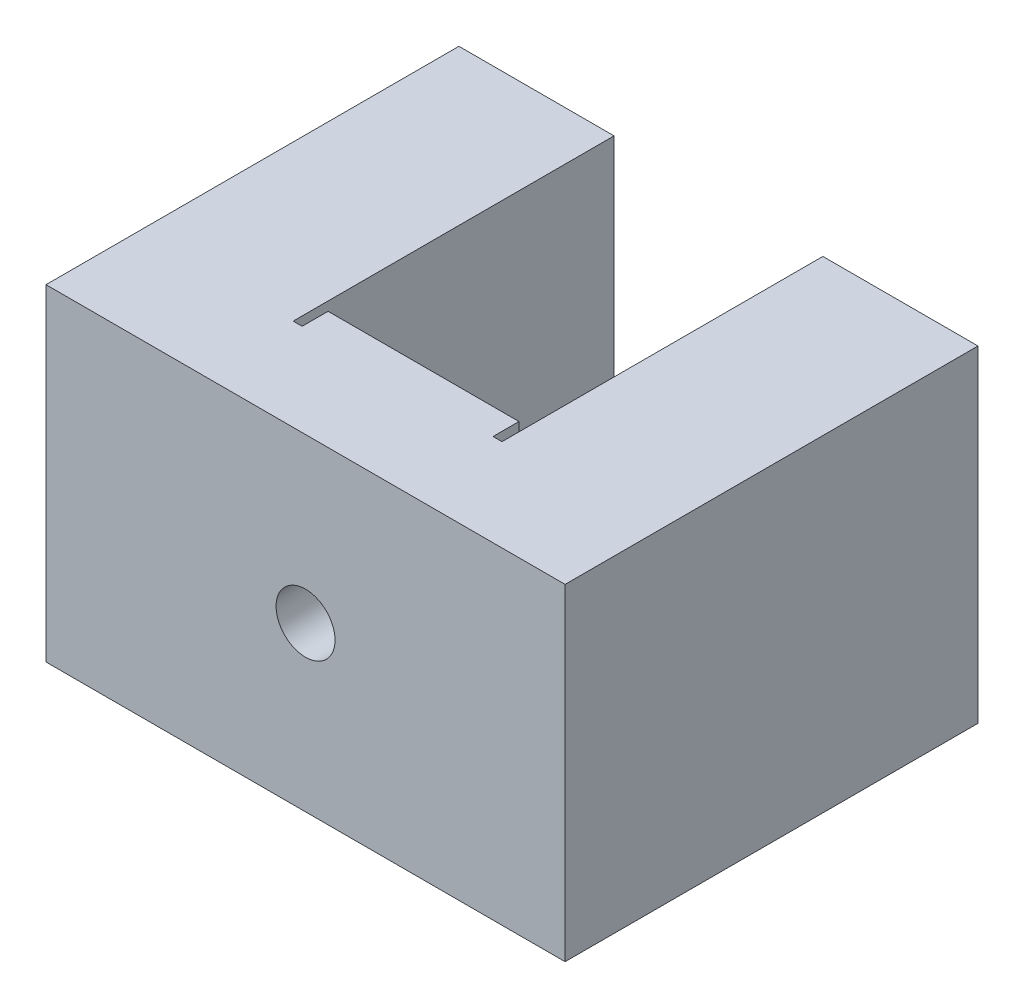
ISO-10303-21;
HEADER;
FILE_DESCRIPTION(('STEP AP214'),'2;1');
FILE_NAME('part.step','',(''),(''),'','','');
FILE_SCHEMA(('AUTOMOTIVE_DESIGN { 1 0 10303 214 1 1 1 1 }'));
ENDSEC;
DATA;
#1=APPLICATION_CONTEXT('core data for automotive mechanical design processes');
#2=APPLICATION_PROTOCOL_DEFINITION('international standard','automotive_design',2000,#1);
#3=PRODUCT_CONTEXT('',#1,'mechanical');
#4=PRODUCT('Part','Part','',(#3));
#5=PRODUCT_RELATED_PRODUCT_CATEGORY('part','',(#4));
#6=PRODUCT_DEFINITION_FORMATION('','',#4);
#7=PRODUCT_DEFINITION_CONTEXT('part definition',#1,'design');
#8=PRODUCT_DEFINITION('design','',#6,#7);
#9=PRODUCT_DEFINITION_SHAPE('','',#8);
#10=(LENGTH_UNIT() NAMED_UNIT(*) SI_UNIT(.MILLI.,.METRE.));
#11=(NAMED_UNIT(*) PLANE_ANGLE_UNIT() SI_UNIT($,.RADIAN.));
#12=(NAMED_UNIT(*) SI_UNIT($,.STERADIAN.) SOLID_ANGLE_UNIT());
#13=UNCERTAINTY_MEASURE_WITH_UNIT(LENGTH_MEASURE(1.E-05),#10,'distance_accuracy_value','');
#14=(GEOMETRIC_REPRESENTATION_CONTEXT(3) GLOBAL_UNCERTAINTY_ASSIGNED_CONTEXT((#13)) GLOBAL_UNIT_ASSIGNED_CONTEXT((#10,
#11,#12)) REPRESENTATION_CONTEXT('',''));
#15=CARTESIAN_POINT('',(0.,0.,0.));
#16=DIRECTION('',(0.,0.,1.));
#17=DIRECTION('',(1.,0.,0.));
#18=AXIS2_PLACEMENT_3D('',#15,#16,#17);
#19=CARTESIAN_POINT('',(0.,0.,0.));
#20=DIRECTION('',(0.,0.,-1.));
#21=DIRECTION('',(-1.,0.,0.));
#22=AXIS2_PLACEMENT_3D('',#19,#20,#21);
#23=PLANE('',#22);
#24=DIRECTION('',(0.,1.,0.));
#25=VECTOR('',#24,1.);
#26=CARTESIAN_POINT('',(8.09,0.,0.));
#27=LINE('',#26,#25);
#28=CARTESIAN_POINT('',(8.09,-13.85,0.));
#29=VERTEX_POINT('',#28);
#30=CARTESIAN_POINT('',(8.09,13.85,0.));
#31=VERTEX_POINT('',#30);
#32=EDGE_CURVE('E151',#29,#31,#27,.T.);
#33=ORIENTED_EDGE('',*,*,#32,.F.);
#34=DIRECTION('',(1.,0.,0.));
#35=VECTOR('',#34,1.);
#36=CARTESIAN_POINT('',(22.,-13.85,0.));
#37=LINE('',#36,#35);
#38=CARTESIAN_POINT('',(-8.09,-13.85,0.));
#39=VERTEX_POINT('',#38);
#40=EDGE_CURVE('E157',#39,#29,#37,.T.);
#41=ORIENTED_EDGE('',*,*,#40,.F.);
#42=DIRECTION('',(0.,1.,0.));
#43=VECTOR('',#42,1.);
#44=CARTESIAN_POINT('',(-8.09,0.,0.));
#45=LINE('',#44,#43);
#46=CARTESIAN_POINT('',(-8.09,13.85,0.));
#47=VERTEX_POINT('',#46);
#48=EDGE_CURVE('E171',#39,#47,#45,.T.);
#49=ORIENTED_EDGE('',*,*,#48,.T.);
#50=DIRECTION('',(-1.,0.,0.));
#51=VECTOR('',#50,1.);
#52=CARTESIAN_POINT('',(22.,13.85,0.));
#53=LINE('',#52,#51);
#54=EDGE_CURVE('E245',#31,#47,#53,.T.);
#55=ORIENTED_EDGE('',*,*,#54,.F.);
#56=EDGE_LOOP('',(#33,#41,#49,#55));
#57=FACE_BOUND('',#56,.T.);
#58=CARTESIAN_POINT('',(0.,0.,0.));
#59=DIRECTION('',(0.,0.,1.));
#60=DIRECTION('',(1.,0.,0.));
#61=AXIS2_PLACEMENT_3D('',#58,#59,#60);
#62=CIRCLE('',#61,2.5);
#63=CARTESIAN_POINT('',(2.5,0.,0.));
#64=VERTEX_POINT('',#63);
#65=EDGE_CURVE('E192',#64,#64,#62,.T.);
#66=ORIENTED_EDGE('',*,*,#65,.T.);
#67=EDGE_LOOP('',(#66));
#68=FACE_BOUND('',#67,.T.);
#69=ADVANCED_FACE('F40',(#57,#68),#23,.T.);
#70=CARTESIAN_POINT('',(22.,-13.85,10.));
#71=DIRECTION('',(0.,1.,0.));
#72=DIRECTION('',(0.,0.,1.));
#73=AXIS2_PLACEMENT_3D('',#70,#71,#72);
#74=PLANE('',#73);
#75=DIRECTION('',(-1.,0.,0.));
#76=VECTOR('',#75,1.);
#77=CARTESIAN_POINT('',(0.,-13.85,2.2));
#78=LINE('',#77,#76);
#79=CARTESIAN_POINT('',(8.85,-13.85,2.2));
#80=VERTEX_POINT('',#79);
#81=CARTESIAN_POINT('',(8.09,-13.85,2.2));
#82=VERTEX_POINT('',#81);
#83=EDGE_CURVE('E141',#80,#82,#78,.T.);
#84=ORIENTED_EDGE('',*,*,#83,.F.);
#85=DIRECTION('',(0.,0.,1.));
#86=VECTOR('',#85,1.);
#87=CARTESIAN_POINT('',(8.85,-13.85,-25.));
#88=LINE('',#87,#86);
#89=CARTESIAN_POINT('',(8.85,-13.85,-25.));
#90=VERTEX_POINT('',#89);
#91=EDGE_CURVE('E235',#90,#80,#88,.T.);
#92=ORIENTED_EDGE('',*,*,#91,.F.);
#93=DIRECTION('',(-1.,0.,0.));
#94=VECTOR('',#93,1.);
#95=CARTESIAN_POINT('',(0.,-13.85,-25.));
#96=LINE('',#95,#94);
#97=CARTESIAN_POINT('',(22.,-13.85,-25.));
#98=VERTEX_POINT('',#97);
#99=EDGE_CURVE('E232',#98,#90,#96,.T.);
#100=ORIENTED_EDGE('',*,*,#99,.F.);
#101=DIRECTION('',(0.,0.,-1.));
#102=VECTOR('',#101,1.);
#103=CARTESIAN_POINT('',(22.,-13.85,10.));
#104=LINE('',#103,#102);
#105=CARTESIAN_POINT('',(22.,-13.85,10.));
#106=VERTEX_POINT('',#105);
#107=EDGE_CURVE('E49',#106,#98,#104,.T.);
#108=ORIENTED_EDGE('',*,*,#107,.F.);
#109=DIRECTION('',(1.,0.,0.));
#110=VECTOR('',#109,1.);
#111=CARTESIAN_POINT('',(22.,-13.85,10.));
#112=LINE('',#111,#110);
#113=CARTESIAN_POINT('',(-22.,-13.85,10.));
#114=VERTEX_POINT('',#113);
#115=EDGE_CURVE('E244',#114,#106,#112,.T.);
#116=ORIENTED_EDGE('',*,*,#115,.F.);
#117=DIRECTION('',(0.,0.,-1.));
#118=VECTOR('',#117,1.);
#119=CARTESIAN_POINT('',(-22.,-13.85,10.));
#120=LINE('',#119,#118);
#121=CARTESIAN_POINT('',(-22.,-13.85,-25.));
#122=VERTEX_POINT('',#121);
#123=EDGE_CURVE('E11',#114,#122,#120,.T.);
#124=ORIENTED_EDGE('',*,*,#123,.T.);
#125=DIRECTION('',(-1.,0.,0.));
#126=VECTOR('',#125,1.);
#127=CARTESIAN_POINT('',(0.,-13.85,-25.));
#128=LINE('',#127,#126);
#129=CARTESIAN_POINT('',(-8.85,-13.85,-25.));
#130=VERTEX_POINT('',#129);
#131=EDGE_CURVE('E206',#130,#122,#128,.T.);
#132=ORIENTED_EDGE('',*,*,#131,.F.);
#133=DIRECTION('',(0.,0.,1.));
#134=VECTOR('',#133,1.);
#135=CARTESIAN_POINT('',(-8.85,-13.85,-25.));
#136=LINE('',#135,#134);
#137=CARTESIAN_POINT('',(-8.85,-13.85,2.2));
#138=VERTEX_POINT('',#137);
#139=EDGE_CURVE('E214',#130,#138,#136,.T.);
#140=ORIENTED_EDGE('',*,*,#139,.T.);
#141=DIRECTION('',(-1.,0.,0.));
#142=VECTOR('',#141,1.);
#143=CARTESIAN_POINT('',(0.,-13.85,2.2));
#144=LINE('',#143,#142);
#145=CARTESIAN_POINT('',(-8.09,-13.85,2.2));
#146=VERTEX_POINT('',#145);
#147=EDGE_CURVE('E170',#146,#138,#144,.T.);
#148=ORIENTED_EDGE('',*,*,#147,.F.);
#149=DIRECTION('',(0.,0.,-1.));
#150=VECTOR('',#149,1.);
#151=CARTESIAN_POINT('',(-8.09,-13.85,2.2));
#152=LINE('',#151,#150);
#153=EDGE_CURVE('E183',#146,#39,#152,.T.);
#154=ORIENTED_EDGE('',*,*,#153,.T.);
#155=ORIENTED_EDGE('',*,*,#40,.T.);
#156=DIRECTION('',(0.,0.,-1.));
#157=VECTOR('',#156,1.);
#158=CARTESIAN_POINT('',(8.09,-13.85,2.2));
#159=LINE('',#158,#157);
#160=EDGE_CURVE('E132',#82,#29,#159,.T.);
#161=ORIENTED_EDGE('',*,*,#160,.F.);
#162=EDGE_LOOP('',(#84,#92,#100,#108,#116,#124,#132,#140,#148,#154,#155,#161));
#163=FACE_BOUND('',#162,.T.);
#164=ADVANCED_FACE('F154',(#163),#74,.F.);
#165=CARTESIAN_POINT('',(22.,13.85,10.));
#166=DIRECTION('',(0.,-1.,0.));
#167=DIRECTION('',(1.,0.,0.));
#168=AXIS2_PLACEMENT_3D('',#165,#166,#167);
#169=PLANE('',#168);
#170=DIRECTION('',(0.,0.,1.));
#171=VECTOR('',#170,1.);
#172=CARTESIAN_POINT('',(8.85,13.85,-25.));
#173=LINE('',#172,#171);
#174=CARTESIAN_POINT('',(8.85,13.85,-25.));
#175=VERTEX_POINT('',#174);
#176=CARTESIAN_POINT('',(8.85,13.85,2.2));
#177=VERTEX_POINT('',#176);
#178=EDGE_CURVE('E238',#175,#177,#173,.T.);
#179=ORIENTED_EDGE('',*,*,#178,.T.);
#180=DIRECTION('',(1.,0.,0.));
#181=VECTOR('',#180,1.);
#182=CARTESIAN_POINT('',(0.,13.85,2.2));
#183=LINE('',#182,#181);
#184=CARTESIAN_POINT('',(8.09,13.85,2.2));
#185=VERTEX_POINT('',#184);
#186=EDGE_CURVE('E140',#185,#177,#183,.T.);
#187=ORIENTED_EDGE('',*,*,#186,.F.);
#188=DIRECTION('',(0.,0.,-1.));
#189=VECTOR('',#188,1.);
#190=CARTESIAN_POINT('',(8.09,13.85,2.2));
#191=LINE('',#190,#189);
#192=EDGE_CURVE('E135',#185,#31,#191,.T.);
#193=ORIENTED_EDGE('',*,*,#192,.T.);
#194=ORIENTED_EDGE('',*,*,#54,.T.);
#195=DIRECTION('',(0.,0.,-1.));
#196=VECTOR('',#195,1.);
#197=CARTESIAN_POINT('',(-8.09,13.85,2.2));
#198=LINE('',#197,#196);
#199=CARTESIAN_POINT('',(-8.09,13.85,2.2));
#200=VERTEX_POINT('',#199);
#201=EDGE_CURVE('E187',#200,#47,#198,.T.);
#202=ORIENTED_EDGE('',*,*,#201,.F.);
#203=DIRECTION('',(1.,0.,0.));
#204=VECTOR('',#203,1.);
#205=CARTESIAN_POINT('',(0.,13.85,2.2));
#206=LINE('',#205,#204);
#207=CARTESIAN_POINT('',(-8.85,13.85,2.2));
#208=VERTEX_POINT('',#207);
#209=EDGE_CURVE('E179',#208,#200,#206,.T.);
#210=ORIENTED_EDGE('',*,*,#209,.F.);
#211=DIRECTION('',(0.,0.,1.));
#212=VECTOR('',#211,1.);
#213=CARTESIAN_POINT('',(-8.85,13.85,-25.));
#214=LINE('',#213,#212);
#215=CARTESIAN_POINT('',(-8.85,13.85,-25.));
#216=VERTEX_POINT('',#215);
#217=EDGE_CURVE('E217',#216,#208,#214,.T.);
#218=ORIENTED_EDGE('',*,*,#217,.F.);
#219=DIRECTION('',(1.,0.,0.));
#220=VECTOR('',#219,1.);
#221=CARTESIAN_POINT('',(0.,13.85,-25.));
#222=LINE('',#221,#220);
#223=CARTESIAN_POINT('',(-22.,13.85,-25.));
#224=VERTEX_POINT('',#223);
#225=EDGE_CURVE('E196',#224,#216,#222,.T.);
#226=ORIENTED_EDGE('',*,*,#225,.F.);
#227=DIRECTION('',(0.,0.,-1.));
#228=VECTOR('',#227,1.);
#229=CARTESIAN_POINT('',(-22.,13.85,10.));
#230=LINE('',#229,#228);
#231=CARTESIAN_POINT('',(-22.,13.85,10.));
#232=VERTEX_POINT('',#231);
#233=EDGE_CURVE('E252',#232,#224,#230,.T.);
#234=ORIENTED_EDGE('',*,*,#233,.F.);
#235=DIRECTION('',(-1.,0.,0.));
#236=VECTOR('',#235,1.);
#237=CARTESIAN_POINT('',(22.,13.85,10.));
#238=LINE('',#237,#236);
#239=CARTESIAN_POINT('',(22.,13.85,10.));
#240=VERTEX_POINT('',#239);
#241=EDGE_CURVE('E56',#240,#232,#238,.T.);
#242=ORIENTED_EDGE('',*,*,#241,.F.);
#243=DIRECTION('',(0.,0.,-1.));
#244=VECTOR('',#243,1.);
#245=CARTESIAN_POINT('',(22.,13.85,10.));
#246=LINE('',#245,#244);
#247=CARTESIAN_POINT('',(22.,13.85,-25.));
#248=VERTEX_POINT('',#247);
#249=EDGE_CURVE('E260',#240,#248,#246,.T.);
#250=ORIENTED_EDGE('',*,*,#249,.T.);
#251=DIRECTION('',(1.,0.,0.));
#252=VECTOR('',#251,1.);
#253=CARTESIAN_POINT('',(0.,13.85,-25.));
#254=LINE('',#253,#252);
#255=EDGE_CURVE('E224',#175,#248,#254,.T.);
#256=ORIENTED_EDGE('',*,*,#255,.F.);
#257=EDGE_LOOP('',(#179,#187,#193,#194,#202,#210,#218,#226,#234,#242,#250,#256));
#258=FACE_BOUND('',#257,.T.);
#259=ADVANCED_FACE('F275',(#258),#169,.F.);
#260=CARTESIAN_POINT('',(-22.,13.85,10.));
#261=DIRECTION('',(1.,0.,0.));
#262=DIRECTION('',(0.,1.,0.));
#263=AXIS2_PLACEMENT_3D('',#260,#261,#262);
#264=PLANE('',#263);
#265=ORIENTED_EDGE('',*,*,#233,.T.);
#266=DIRECTION('',(0.,1.,0.));
#267=VECTOR('',#266,1.);
#268=CARTESIAN_POINT('',(-22.,0.,-25.));
#269=LINE('',#268,#267);
#270=EDGE_CURVE('E210',#122,#224,#269,.T.);
#271=ORIENTED_EDGE('',*,*,#270,.F.);
#272=ORIENTED_EDGE('',*,*,#123,.F.);
#273=DIRECTION('',(0.,-1.,0.));
#274=VECTOR('',#273,1.);
#275=CARTESIAN_POINT('',(-22.,13.85,10.));
#276=LINE('',#275,#274);
#277=EDGE_CURVE('E241',#232,#114,#276,.T.);
#278=ORIENTED_EDGE('',*,*,#277,.F.);
#279=EDGE_LOOP('',(#265,#271,#272,#278));
#280=FACE_BOUND('',#279,.T.);
#281=ADVANCED_FACE('F42',(#280),#264,.F.);
#282=CARTESIAN_POINT('',(22.,13.85,10.));
#283=DIRECTION('',(-1.,0.,0.));
#284=DIRECTION('',(0.,-1.,0.));
#285=AXIS2_PLACEMENT_3D('',#282,#283,#284);
#286=PLANE('',#285);
#287=ORIENTED_EDGE('',*,*,#107,.T.);
#288=DIRECTION('',(0.,-1.,0.));
#289=VECTOR('',#288,1.);
#290=CARTESIAN_POINT('',(22.,0.,-25.));
#291=LINE('',#290,#289);
#292=EDGE_CURVE('E228',#248,#98,#291,.T.);
#293=ORIENTED_EDGE('',*,*,#292,.F.);
#294=ORIENTED_EDGE('',*,*,#249,.F.);
#295=DIRECTION('',(0.,1.,0.));
#296=VECTOR('',#295,1.);
#297=CARTESIAN_POINT('',(22.,13.85,10.));
#298=LINE('',#297,#296);
#299=EDGE_CURVE('E61',#106,#240,#298,.T.);
#300=ORIENTED_EDGE('',*,*,#299,.F.);
#301=EDGE_LOOP('',(#287,#293,#294,#300));
#302=FACE_BOUND('',#301,.T.);
#303=ADVANCED_FACE('F266',(#302),#286,.F.);
#304=CARTESIAN_POINT('',(0.,0.,10.));
#305=DIRECTION('',(0.,0.,-1.));
#306=DIRECTION('',(-1.,0.,0.));
#307=AXIS2_PLACEMENT_3D('',#304,#305,#306);
#308=PLANE('',#307);
#309=CARTESIAN_POINT('',(0.,0.,10.));
#310=DIRECTION('',(0.,0.,1.));
#311=DIRECTION('',(1.,0.,0.));
#312=AXIS2_PLACEMENT_3D('',#309,#310,#311);
#313=CIRCLE('',#312,2.5);
#314=CARTESIAN_POINT('',(2.5,0.,10.));
#315=VERTEX_POINT('',#314);
#316=EDGE_CURVE('E162',#315,#315,#313,.T.);
#317=ORIENTED_EDGE('',*,*,#316,.F.);
#318=EDGE_LOOP('',(#317));
#319=FACE_BOUND('',#318,.T.);
#320=ORIENTED_EDGE('',*,*,#277,.T.);
#321=ORIENTED_EDGE('',*,*,#115,.T.);
#322=ORIENTED_EDGE('',*,*,#299,.T.);
#323=ORIENTED_EDGE('',*,*,#241,.T.);
#324=EDGE_LOOP('',(#320,#321,#322,#323));
#325=FACE_BOUND('',#324,.T.);
#326=ADVANCED_FACE('F282',(#319,#325),#308,.F.);
#327=CARTESIAN_POINT('',(8.85,0.,-25.));
#328=DIRECTION('',(-1.,0.,0.));
#329=DIRECTION('',(0.,0.,1.));
#330=AXIS2_PLACEMENT_3D('',#327,#328,#329);
#331=PLANE('',#330);
#332=ORIENTED_EDGE('',*,*,#91,.T.);
#333=DIRECTION('',(0.,-1.,0.));
#334=VECTOR('',#333,1.);
#335=CARTESIAN_POINT('',(8.85,0.,2.2));
#336=LINE('',#335,#334);
#337=EDGE_CURVE('E147',#177,#80,#336,.T.);
#338=ORIENTED_EDGE('',*,*,#337,.F.);
#339=ORIENTED_EDGE('',*,*,#178,.F.);
#340=DIRECTION('',(0.,-1.,0.));
#341=VECTOR('',#340,1.);
#342=CARTESIAN_POINT('',(8.85,0.,-25.));
#343=LINE('',#342,#341);
#344=EDGE_CURVE('E220',#175,#90,#343,.T.);
#345=ORIENTED_EDGE('',*,*,#344,.T.);
#346=EDGE_LOOP('',(#332,#338,#339,#345));
#347=FACE_BOUND('',#346,.T.);
#348=ADVANCED_FACE('F273',(#347),#331,.T.);
#349=CARTESIAN_POINT('',(0.,0.,-25.));
#350=DIRECTION('',(0.,0.,-1.));
#351=DIRECTION('',(-1.,0.,0.));
#352=AXIS2_PLACEMENT_3D('',#349,#350,#351);
#353=PLANE('',#352);
#354=ORIENTED_EDGE('',*,*,#344,.F.);
#355=ORIENTED_EDGE('',*,*,#255,.T.);
#356=ORIENTED_EDGE('',*,*,#292,.T.);
#357=ORIENTED_EDGE('',*,*,#99,.T.);
#358=EDGE_LOOP('',(#354,#355,#356,#357));
#359=FACE_BOUND('',#358,.T.);
#360=ADVANCED_FACE('F270',(#359),#353,.T.);
#361=CARTESIAN_POINT('',(-8.85,0.,-25.));
#362=DIRECTION('',(-1.,0.,0.));
#363=DIRECTION('',(0.,0.,1.));
#364=AXIS2_PLACEMENT_3D('',#361,#362,#363);
#365=PLANE('',#364);
#366=ORIENTED_EDGE('',*,*,#217,.T.);
#367=DIRECTION('',(0.,1.,0.));
#368=VECTOR('',#367,1.);
#369=CARTESIAN_POINT('',(-8.85,0.,2.2));
#370=LINE('',#369,#368);
#371=EDGE_CURVE('E175',#138,#208,#370,.T.);
#372=ORIENTED_EDGE('',*,*,#371,.F.);
#373=ORIENTED_EDGE('',*,*,#139,.F.);
#374=DIRECTION('',(0.,-1.,0.));
#375=VECTOR('',#374,1.);
#376=CARTESIAN_POINT('',(-8.85,0.,-25.));
#377=LINE('',#376,#375);
#378=EDGE_CURVE('E203',#216,#130,#377,.T.);
#379=ORIENTED_EDGE('',*,*,#378,.F.);
#380=EDGE_LOOP('',(#366,#372,#373,#379));
#381=FACE_BOUND('',#380,.T.);
#382=ADVANCED_FACE('F289',(#381),#365,.F.);
#383=CARTESIAN_POINT('',(0.,0.,-25.));
#384=DIRECTION('',(0.,0.,-1.));
#385=DIRECTION('',(-1.,0.,0.));
#386=AXIS2_PLACEMENT_3D('',#383,#384,#385);
#387=PLANE('',#386);
#388=ORIENTED_EDGE('',*,*,#225,.T.);
#389=ORIENTED_EDGE('',*,*,#378,.T.);
#390=ORIENTED_EDGE('',*,*,#131,.T.);
#391=ORIENTED_EDGE('',*,*,#270,.T.);
#392=EDGE_LOOP('',(#388,#389,#390,#391));
#393=FACE_BOUND('',#392,.T.);
#394=ADVANCED_FACE('F285',(#393),#387,.T.);
#395=CARTESIAN_POINT('',(0.,0.,0.));
#396=DIRECTION('',(0.,0.,1.));
#397=DIRECTION('',(1.,0.,0.));
#398=AXIS2_PLACEMENT_3D('',#395,#396,#397);
#399=CYLINDRICAL_SURFACE('',#398,2.5);
#400=ORIENTED_EDGE('',*,*,#65,.F.);
#401=EDGE_LOOP('',(#400));
#402=FACE_BOUND('',#401,.T.);
#403=ORIENTED_EDGE('',*,*,#316,.T.);
#404=EDGE_LOOP('',(#403));
#405=FACE_BOUND('',#404,.T.);
#406=ADVANCED_FACE('F308',(#402,#405),#399,.F.);
#407=CARTESIAN_POINT('',(-8.09,0.,2.2));
#408=DIRECTION('',(-1.,0.,0.));
#409=DIRECTION('',(0.,0.,1.));
#410=AXIS2_PLACEMENT_3D('',#407,#408,#409);
#411=PLANE('',#410);
#412=ORIENTED_EDGE('',*,*,#48,.F.);
#413=ORIENTED_EDGE('',*,*,#153,.F.);
#414=DIRECTION('',(0.,1.,0.));
#415=VECTOR('',#414,1.);
#416=CARTESIAN_POINT('',(-8.09,0.,2.2));
#417=LINE('',#416,#415);
#418=EDGE_CURVE('E167',#146,#200,#417,.T.);
#419=ORIENTED_EDGE('',*,*,#418,.T.);
#420=ORIENTED_EDGE('',*,*,#201,.T.);
#421=EDGE_LOOP('',(#412,#413,#419,#420));
#422=FACE_BOUND('',#421,.T.);
#423=ADVANCED_FACE('F297',(#422),#411,.T.);
#424=CARTESIAN_POINT('',(0.,0.,2.2));
#425=DIRECTION('',(0.,0.,-1.));
#426=DIRECTION('',(-1.,0.,0.));
#427=AXIS2_PLACEMENT_3D('',#424,#425,#426);
#428=PLANE('',#427);
#429=ORIENTED_EDGE('',*,*,#418,.F.);
#430=ORIENTED_EDGE('',*,*,#147,.T.);
#431=ORIENTED_EDGE('',*,*,#371,.T.);
#432=ORIENTED_EDGE('',*,*,#209,.T.);
#433=EDGE_LOOP('',(#429,#430,#431,#432));
#434=FACE_BOUND('',#433,.T.);
#435=ADVANCED_FACE('F293',(#434),#428,.T.);
#436=CARTESIAN_POINT('',(8.09,0.,2.2));
#437=DIRECTION('',(-1.,0.,0.));
#438=DIRECTION('',(0.,0.,1.));
#439=AXIS2_PLACEMENT_3D('',#436,#437,#438);
#440=PLANE('',#439);
#441=ORIENTED_EDGE('',*,*,#32,.T.);
#442=ORIENTED_EDGE('',*,*,#192,.F.);
#443=DIRECTION('',(0.,1.,0.));
#444=VECTOR('',#443,1.);
#445=CARTESIAN_POINT('',(8.09,0.,2.2));
#446=LINE('',#445,#444);
#447=EDGE_CURVE('E128',#82,#185,#446,.T.);
#448=ORIENTED_EDGE('',*,*,#447,.F.);
#449=ORIENTED_EDGE('',*,*,#160,.T.);
#450=EDGE_LOOP('',(#441,#442,#448,#449));
#451=FACE_BOUND('',#450,.T.);
#452=ADVANCED_FACE('F130',(#451),#440,.F.);
#453=CARTESIAN_POINT('',(0.,0.,2.2));
#454=DIRECTION('',(0.,0.,-1.));
#455=DIRECTION('',(-1.,0.,0.));
#456=AXIS2_PLACEMENT_3D('',#453,#454,#455);
#457=PLANE('',#456);
#458=ORIENTED_EDGE('',*,*,#83,.T.);
#459=ORIENTED_EDGE('',*,*,#447,.T.);
#460=ORIENTED_EDGE('',*,*,#186,.T.);
#461=ORIENTED_EDGE('',*,*,#337,.T.);
#462=EDGE_LOOP('',(#458,#459,#460,#461));
#463=FACE_BOUND('',#462,.T.);
#464=ADVANCED_FACE('F145',(#463),#457,.T.);
#465=CLOSED_SHELL('',(#69,#164,#259,#281,#303,#326,#348,#360,#382,#394,#406,#423,#435,#452,#464));
#466=MANIFOLD_SOLID_BREP('B2',#465);
#467=ADVANCED_BREP_SHAPE_REPRESENTATION('',(#18,#466),#14);
#468=SHAPE_DEFINITION_REPRESENTATION(#9,#467);
ENDSEC;
END-ISO-10303-21;
